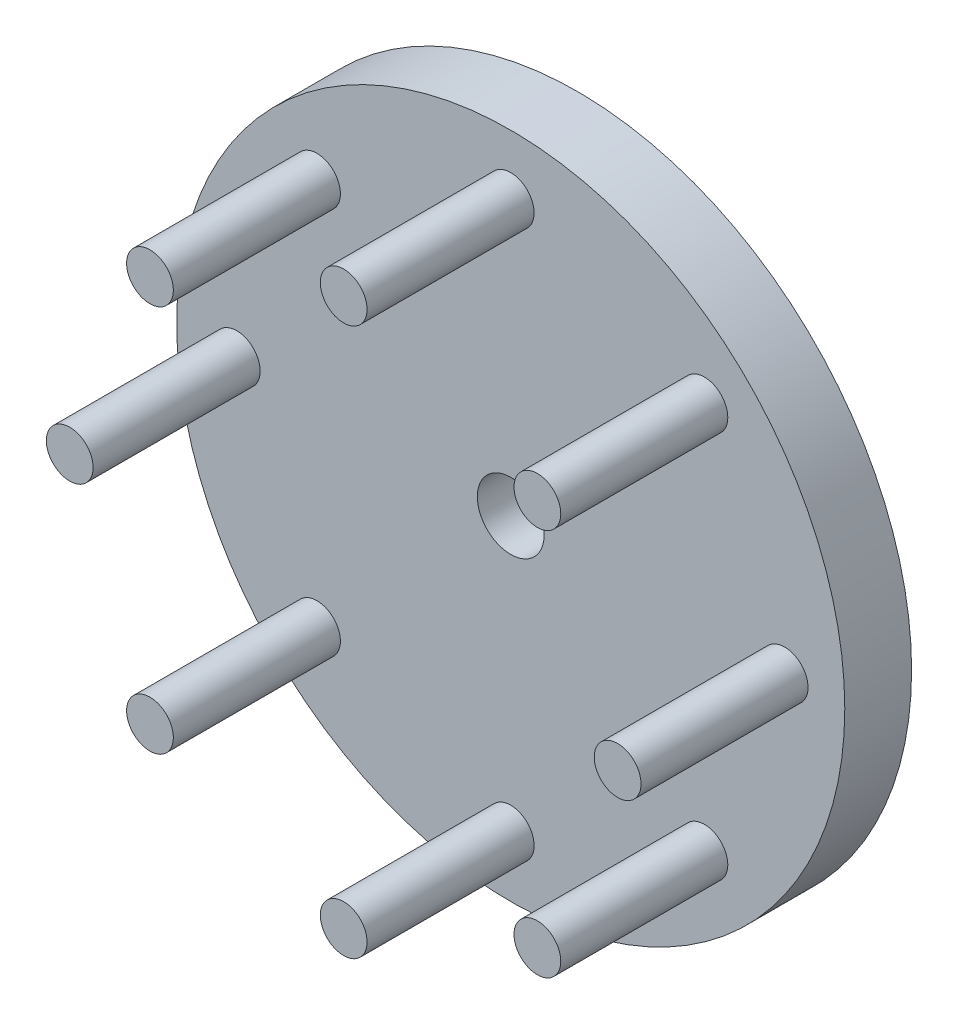
ISO-10303-21;
HEADER;
FILE_DESCRIPTION(('STEP AP214'),'2;1');
FILE_NAME('part.step','',(''),(''),'','','');
FILE_SCHEMA(('AUTOMOTIVE_DESIGN { 1 0 10303 214 1 1 1 1 }'));
ENDSEC;
DATA;
#1=APPLICATION_CONTEXT('core data for automotive mechanical design processes');
#2=APPLICATION_PROTOCOL_DEFINITION('international standard','automotive_design',2000,#1);
#3=PRODUCT_CONTEXT('',#1,'mechanical');
#4=PRODUCT('Part','Part','',(#3));
#5=PRODUCT_RELATED_PRODUCT_CATEGORY('part','',(#4));
#6=PRODUCT_DEFINITION_FORMATION('','',#4);
#7=PRODUCT_DEFINITION_CONTEXT('part definition',#1,'design');
#8=PRODUCT_DEFINITION('design','',#6,#7);
#9=PRODUCT_DEFINITION_SHAPE('','',#8);
#10=(LENGTH_UNIT() NAMED_UNIT(*) SI_UNIT(.MILLI.,.METRE.));
#11=(NAMED_UNIT(*) PLANE_ANGLE_UNIT() SI_UNIT($,.RADIAN.));
#12=(NAMED_UNIT(*) SI_UNIT($,.STERADIAN.) SOLID_ANGLE_UNIT());
#13=UNCERTAINTY_MEASURE_WITH_UNIT(LENGTH_MEASURE(1.E-05),#10,'distance_accuracy_value','');
#14=(GEOMETRIC_REPRESENTATION_CONTEXT(3) GLOBAL_UNCERTAINTY_ASSIGNED_CONTEXT((#13)) GLOBAL_UNIT_ASSIGNED_CONTEXT((#10,
#11,#12)) REPRESENTATION_CONTEXT('',''));
#15=CARTESIAN_POINT('',(0.,0.,0.));
#16=DIRECTION('',(0.,0.,1.));
#17=DIRECTION('',(1.,0.,0.));
#18=AXIS2_PLACEMENT_3D('',#15,#16,#17);
#19=CARTESIAN_POINT('',(0.,0.,10.));
#20=DIRECTION('',(0.,0.,1.));
#21=DIRECTION('',(1.,0.,0.));
#22=AXIS2_PLACEMENT_3D('',#19,#20,#21);
#23=PLANE('',#22);
#24=CARTESIAN_POINT('',(-28.9913780286479,28.9913780286472,10.));
#25=DIRECTION('',(0.,0.,1.));
#26=DIRECTION('',(1.,0.,0.));
#27=AXIS2_PLACEMENT_3D('',#24,#25,#26);
#28=CIRCLE('',#27,3.50000000000134);
#29=CARTESIAN_POINT('',(-25.4913780286466,28.9913780286472,10.));
#30=VERTEX_POINT('',#29);
#31=EDGE_CURVE('E92',#30,#30,#28,.T.);
#32=ORIENTED_EDGE('',*,*,#31,.F.);
#33=EDGE_LOOP('',(#32));
#34=FACE_BOUND('',#33,.T.);
#35=CARTESIAN_POINT('',(-40.9999999999983,-1.74793512996985E-12,10.));
#36=DIRECTION('',(0.,0.,1.));
#37=DIRECTION('',(1.,0.,0.));
#38=AXIS2_PLACEMENT_3D('',#35,#36,#37);
#39=CIRCLE('',#38,3.50000000000259);
#40=CARTESIAN_POINT('',(-37.4999999999957,-1.74793512996985E-12,10.));
#41=VERTEX_POINT('',#40);
#42=EDGE_CURVE('E86',#41,#41,#39,.T.);
#43=ORIENTED_EDGE('',*,*,#42,.F.);
#44=EDGE_LOOP('',(#43));
#45=FACE_BOUND('',#44,.T.);
#46=CARTESIAN_POINT('',(-28.9913780286455,-28.9913780286497,10.));
#47=DIRECTION('',(0.,0.,1.));
#48=DIRECTION('',(1.,0.,0.));
#49=AXIS2_PLACEMENT_3D('',#46,#47,#48);
#50=CIRCLE('',#49,3.50000000000355);
#51=CARTESIAN_POINT('',(-25.4913780286419,-28.9913780286497,10.));
#52=VERTEX_POINT('',#51);
#53=EDGE_CURVE('E80',#52,#52,#50,.T.);
#54=ORIENTED_EDGE('',*,*,#53,.F.);
#55=EDGE_LOOP('',(#54));
#56=FACE_BOUND('',#55,.T.);
#57=CARTESIAN_POINT('',(3.48582815618668E-12,-41.,10.));
#58=DIRECTION('',(0.,0.,1.));
#59=DIRECTION('',(1.,0.,0.));
#60=AXIS2_PLACEMENT_3D('',#57,#58,#59);
#61=CIRCLE('',#60,3.50000000000361);
#62=CARTESIAN_POINT('',(3.5000000000071,-41.,10.));
#63=VERTEX_POINT('',#62);
#64=EDGE_CURVE('E74',#63,#63,#61,.T.);
#65=ORIENTED_EDGE('',*,*,#64,.F.);
#66=EDGE_LOOP('',(#65));
#67=FACE_BOUND('',#66,.T.);
#68=CARTESIAN_POINT('',(28.9913780286514,-28.9913780286472,10.));
#69=DIRECTION('',(0.,0.,1.));
#70=DIRECTION('',(1.,0.,0.));
#71=AXIS2_PLACEMENT_3D('',#68,#69,#70);
#72=CIRCLE('',#71,3.50000000000269);
#73=CARTESIAN_POINT('',(32.4913780286541,-28.9913780286472,10.));
#74=VERTEX_POINT('',#73);
#75=EDGE_CURVE('E68',#74,#74,#72,.T.);
#76=ORIENTED_EDGE('',*,*,#75,.F.);
#77=EDGE_LOOP('',(#76));
#78=FACE_BOUND('',#77,.T.);
#79=CARTESIAN_POINT('',(41.0000000000017,1.74291407809334E-12,10.));
#80=DIRECTION('',(0.,0.,1.));
#81=DIRECTION('',(1.,0.,0.));
#82=AXIS2_PLACEMENT_3D('',#79,#80,#81);
#83=CIRCLE('',#82,3.50000000000129);
#84=CARTESIAN_POINT('',(44.500000000003,1.74291407809334E-12,10.));
#85=VERTEX_POINT('',#84);
#86=EDGE_CURVE('E62',#85,#85,#83,.T.);
#87=ORIENTED_EDGE('',*,*,#86,.F.);
#88=EDGE_LOOP('',(#87));
#89=FACE_BOUND('',#88,.T.);
#90=CARTESIAN_POINT('',(28.991378028649,28.9913780286497,10.));
#91=DIRECTION('',(0.,0.,1.));
#92=DIRECTION('',(1.,0.,0.));
#93=AXIS2_PLACEMENT_3D('',#90,#91,#92);
#94=CIRCLE('',#93,3.5000000000002);
#95=CARTESIAN_POINT('',(32.4913780286492,28.9913780286497,10.));
#96=VERTEX_POINT('',#95);
#97=EDGE_CURVE('E56',#96,#96,#94,.T.);
#98=ORIENTED_EDGE('',*,*,#97,.F.);
#99=EDGE_LOOP('',(#98));
#100=FACE_BOUND('',#99,.T.);
#101=CARTESIAN_POINT('',(0.,41.,10.));
#102=DIRECTION('',(0.,0.,1.));
#103=DIRECTION('',(1.,0.,0.));
#104=AXIS2_PLACEMENT_3D('',#101,#102,#103);
#105=CIRCLE('',#104,3.5);
#106=CARTESIAN_POINT('',(3.5,41.,10.));
#107=VERTEX_POINT('',#106);
#108=EDGE_CURVE('E53',#107,#107,#105,.T.);
#109=ORIENTED_EDGE('',*,*,#108,.F.);
#110=EDGE_LOOP('',(#109));
#111=FACE_BOUND('',#110,.T.);
#112=CARTESIAN_POINT('',(0.,0.,10.));
#113=DIRECTION('',(0.,0.,1.));
#114=DIRECTION('',(1.,0.,0.));
#115=AXIS2_PLACEMENT_3D('',#112,#113,#114);
#116=CIRCLE('',#115,50.);
#117=CARTESIAN_POINT('',(50.,0.,10.));
#118=VERTEX_POINT('',#117);
#119=EDGE_CURVE('E10',#118,#118,#116,.T.);
#120=ORIENTED_EDGE('',*,*,#119,.T.);
#121=EDGE_LOOP('',(#120));
#122=FACE_BOUND('',#121,.T.);
#123=CARTESIAN_POINT('',(0.,0.,10.));
#124=DIRECTION('',(0.,0.,1.));
#125=DIRECTION('',(1.,0.,0.));
#126=AXIS2_PLACEMENT_3D('',#123,#124,#125);
#127=CIRCLE('',#126,5.);
#128=CARTESIAN_POINT('',(5.,0.,10.));
#129=VERTEX_POINT('',#128);
#130=EDGE_CURVE('E45',#129,#129,#127,.T.);
#131=ORIENTED_EDGE('',*,*,#130,.F.);
#132=EDGE_LOOP('',(#131));
#133=FACE_BOUND('',#132,.T.);
#134=ADVANCED_FACE('F34',(#34,#45,#56,#67,#78,#89,#100,#111,#122,#133),#23,.T.);
#135=CARTESIAN_POINT('',(0.,0.,0.));
#136=DIRECTION('',(0.,0.,1.));
#137=DIRECTION('',(1.,0.,0.));
#138=AXIS2_PLACEMENT_3D('',#135,#136,#137);
#139=PLANE('',#138);
#140=CARTESIAN_POINT('',(0.,0.,0.));
#141=DIRECTION('',(0.,0.,1.));
#142=DIRECTION('',(1.,0.,0.));
#143=AXIS2_PLACEMENT_3D('',#140,#141,#142);
#144=CIRCLE('',#143,50.);
#145=CARTESIAN_POINT('',(50.,0.,0.));
#146=VERTEX_POINT('',#145);
#147=EDGE_CURVE('E38',#146,#146,#144,.T.);
#148=ORIENTED_EDGE('',*,*,#147,.F.);
#149=EDGE_LOOP('',(#148));
#150=FACE_BOUND('',#149,.T.);
#151=CARTESIAN_POINT('',(0.,0.,0.));
#152=DIRECTION('',(0.,0.,1.));
#153=DIRECTION('',(1.,0.,0.));
#154=AXIS2_PLACEMENT_3D('',#151,#152,#153);
#155=CIRCLE('',#154,5.);
#156=CARTESIAN_POINT('',(5.,0.,0.));
#157=VERTEX_POINT('',#156);
#158=EDGE_CURVE('E47',#157,#157,#155,.T.);
#159=ORIENTED_EDGE('',*,*,#158,.T.);
#160=EDGE_LOOP('',(#159));
#161=FACE_BOUND('',#160,.T.);
#162=ADVANCED_FACE('F105',(#150,#161),#139,.F.);
#163=CARTESIAN_POINT('',(0.,0.,10.));
#164=DIRECTION('',(0.,0.,-1.));
#165=DIRECTION('',(-1.,0.,0.));
#166=AXIS2_PLACEMENT_3D('',#163,#164,#165);
#167=CYLINDRICAL_SURFACE('',#166,50.);
#168=ORIENTED_EDGE('',*,*,#119,.F.);
#169=EDGE_LOOP('',(#168));
#170=FACE_BOUND('',#169,.T.);
#171=ORIENTED_EDGE('',*,*,#147,.T.);
#172=EDGE_LOOP('',(#171));
#173=FACE_BOUND('',#172,.T.);
#174=ADVANCED_FACE('F36',(#170,#173),#167,.T.);
#175=CARTESIAN_POINT('',(0.,0.,10.));
#176=DIRECTION('',(0.,0.,-1.));
#177=DIRECTION('',(-1.,0.,0.));
#178=AXIS2_PLACEMENT_3D('',#175,#176,#177);
#179=CYLINDRICAL_SURFACE('',#178,5.);
#180=ORIENTED_EDGE('',*,*,#130,.T.);
#181=EDGE_LOOP('',(#180));
#182=FACE_BOUND('',#181,.T.);
#183=ORIENTED_EDGE('',*,*,#158,.F.);
#184=EDGE_LOOP('',(#183));
#185=FACE_BOUND('',#184,.T.);
#186=ADVANCED_FACE('F123',(#182,#185),#179,.F.);
#187=CARTESIAN_POINT('',(0.,41.,35.));
#188=DIRECTION('',(0.,0.,-1.));
#189=DIRECTION('',(-1.,0.,0.));
#190=AXIS2_PLACEMENT_3D('',#187,#188,#189);
#191=CYLINDRICAL_SURFACE('',#190,3.5);
#192=CARTESIAN_POINT('',(0.,41.,35.));
#193=DIRECTION('',(0.,0.,1.));
#194=DIRECTION('',(1.,0.,0.));
#195=AXIS2_PLACEMENT_3D('',#192,#193,#194);
#196=CIRCLE('',#195,3.5);
#197=CARTESIAN_POINT('',(3.5,41.,35.));
#198=VERTEX_POINT('',#197);
#199=EDGE_CURVE('E50',#198,#198,#196,.T.);
#200=ORIENTED_EDGE('',*,*,#199,.F.);
#201=EDGE_LOOP('',(#200));
#202=FACE_BOUND('',#201,.T.);
#203=ORIENTED_EDGE('',*,*,#108,.T.);
#204=EDGE_LOOP('',(#203));
#205=FACE_BOUND('',#204,.T.);
#206=ADVANCED_FACE('F126',(#202,#205),#191,.T.);
#207=CARTESIAN_POINT('',(0.,41.,35.));
#208=DIRECTION('',(0.,0.,1.));
#209=DIRECTION('',(1.,0.,0.));
#210=AXIS2_PLACEMENT_3D('',#207,#208,#209);
#211=PLANE('',#210);
#212=ORIENTED_EDGE('',*,*,#199,.T.);
#213=EDGE_LOOP('',(#212));
#214=FACE_BOUND('',#213,.T.);
#215=ADVANCED_FACE('F140',(#214),#211,.T.);
#216=CARTESIAN_POINT('',(28.991378028649,28.9913780286497,35.));
#217=DIRECTION('',(0.,0.,-1.));
#218=DIRECTION('',(-1.,0.,0.));
#219=AXIS2_PLACEMENT_3D('',#216,#217,#218);
#220=CYLINDRICAL_SURFACE('',#219,3.5000000000002);
#221=CARTESIAN_POINT('',(28.991378028649,28.9913780286497,35.));
#222=DIRECTION('',(0.,0.,1.));
#223=DIRECTION('',(1.,0.,0.));
#224=AXIS2_PLACEMENT_3D('',#221,#222,#223);
#225=CIRCLE('',#224,3.5000000000002);
#226=CARTESIAN_POINT('',(32.4913780286492,28.9913780286497,35.));
#227=VERTEX_POINT('',#226);
#228=EDGE_CURVE('E59',#227,#227,#225,.T.);
#229=ORIENTED_EDGE('',*,*,#228,.F.);
#230=EDGE_LOOP('',(#229));
#231=FACE_BOUND('',#230,.T.);
#232=ORIENTED_EDGE('',*,*,#97,.T.);
#233=EDGE_LOOP('',(#232));
#234=FACE_BOUND('',#233,.T.);
#235=ADVANCED_FACE('F144',(#231,#234),#220,.T.);
#236=CARTESIAN_POINT('',(28.991378028649,28.9913780286497,35.));
#237=DIRECTION('',(0.,0.,1.));
#238=DIRECTION('',(1.,0.,0.));
#239=AXIS2_PLACEMENT_3D('',#236,#237,#238);
#240=PLANE('',#239);
#241=ORIENTED_EDGE('',*,*,#228,.T.);
#242=EDGE_LOOP('',(#241));
#243=FACE_BOUND('',#242,.T.);
#244=ADVANCED_FACE('F146',(#243),#240,.T.);
#245=CARTESIAN_POINT('',(41.0000000000017,1.74291407809334E-12,35.));
#246=DIRECTION('',(0.,0.,-1.));
#247=DIRECTION('',(-1.,0.,0.));
#248=AXIS2_PLACEMENT_3D('',#245,#246,#247);
#249=CYLINDRICAL_SURFACE('',#248,3.50000000000129);
#250=CARTESIAN_POINT('',(41.0000000000017,1.74291407809334E-12,35.));
#251=DIRECTION('',(0.,0.,1.));
#252=DIRECTION('',(1.,0.,0.));
#253=AXIS2_PLACEMENT_3D('',#250,#251,#252);
#254=CIRCLE('',#253,3.50000000000129);
#255=CARTESIAN_POINT('',(44.500000000003,1.74291407809334E-12,35.));
#256=VERTEX_POINT('',#255);
#257=EDGE_CURVE('E65',#256,#256,#254,.T.);
#258=ORIENTED_EDGE('',*,*,#257,.F.);
#259=EDGE_LOOP('',(#258));
#260=FACE_BOUND('',#259,.T.);
#261=ORIENTED_EDGE('',*,*,#86,.T.);
#262=EDGE_LOOP('',(#261));
#263=FACE_BOUND('',#262,.T.);
#264=ADVANCED_FACE('F149',(#260,#263),#249,.T.);
#265=CARTESIAN_POINT('',(41.0000000000017,1.74291407809334E-12,35.));
#266=DIRECTION('',(0.,0.,1.));
#267=DIRECTION('',(1.,0.,0.));
#268=AXIS2_PLACEMENT_3D('',#265,#266,#267);
#269=PLANE('',#268);
#270=ORIENTED_EDGE('',*,*,#257,.T.);
#271=EDGE_LOOP('',(#270));
#272=FACE_BOUND('',#271,.T.);
#273=ADVANCED_FACE('F154',(#272),#269,.T.);
#274=CARTESIAN_POINT('',(28.9913780286514,-28.9913780286472,35.));
#275=DIRECTION('',(0.,0.,-1.));
#276=DIRECTION('',(-1.,0.,0.));
#277=AXIS2_PLACEMENT_3D('',#274,#275,#276);
#278=CYLINDRICAL_SURFACE('',#277,3.50000000000269);
#279=CARTESIAN_POINT('',(28.9913780286514,-28.9913780286472,35.));
#280=DIRECTION('',(0.,0.,1.));
#281=DIRECTION('',(1.,0.,0.));
#282=AXIS2_PLACEMENT_3D('',#279,#280,#281);
#283=CIRCLE('',#282,3.50000000000269);
#284=CARTESIAN_POINT('',(32.4913780286541,-28.9913780286472,35.));
#285=VERTEX_POINT('',#284);
#286=EDGE_CURVE('E71',#285,#285,#283,.T.);
#287=ORIENTED_EDGE('',*,*,#286,.F.);
#288=EDGE_LOOP('',(#287));
#289=FACE_BOUND('',#288,.T.);
#290=ORIENTED_EDGE('',*,*,#75,.T.);
#291=EDGE_LOOP('',(#290));
#292=FACE_BOUND('',#291,.T.);
#293=ADVANCED_FACE('F157',(#289,#292),#278,.T.);
#294=CARTESIAN_POINT('',(28.9913780286514,-28.9913780286472,35.));
#295=DIRECTION('',(0.,0.,1.));
#296=DIRECTION('',(1.,0.,0.));
#297=AXIS2_PLACEMENT_3D('',#294,#295,#296);
#298=PLANE('',#297);
#299=ORIENTED_EDGE('',*,*,#286,.T.);
#300=EDGE_LOOP('',(#299));
#301=FACE_BOUND('',#300,.T.);
#302=ADVANCED_FACE('F162',(#301),#298,.T.);
#303=CARTESIAN_POINT('',(3.48582815618668E-12,-41.,35.));
#304=DIRECTION('',(0.,0.,-1.));
#305=DIRECTION('',(-1.,0.,0.));
#306=AXIS2_PLACEMENT_3D('',#303,#304,#305);
#307=CYLINDRICAL_SURFACE('',#306,3.50000000000361);
#308=CARTESIAN_POINT('',(3.48582815618668E-12,-41.,35.));
#309=DIRECTION('',(0.,0.,1.));
#310=DIRECTION('',(1.,0.,0.));
#311=AXIS2_PLACEMENT_3D('',#308,#309,#310);
#312=CIRCLE('',#311,3.50000000000361);
#313=CARTESIAN_POINT('',(3.5000000000071,-41.,35.));
#314=VERTEX_POINT('',#313);
#315=EDGE_CURVE('E77',#314,#314,#312,.T.);
#316=ORIENTED_EDGE('',*,*,#315,.F.);
#317=EDGE_LOOP('',(#316));
#318=FACE_BOUND('',#317,.T.);
#319=ORIENTED_EDGE('',*,*,#64,.T.);
#320=EDGE_LOOP('',(#319));
#321=FACE_BOUND('',#320,.T.);
#322=ADVANCED_FACE('F165',(#318,#321),#307,.T.);
#323=CARTESIAN_POINT('',(3.48582815618668E-12,-41.,35.));
#324=DIRECTION('',(0.,0.,1.));
#325=DIRECTION('',(1.,0.,0.));
#326=AXIS2_PLACEMENT_3D('',#323,#324,#325);
#327=PLANE('',#326);
#328=ORIENTED_EDGE('',*,*,#315,.T.);
#329=EDGE_LOOP('',(#328));
#330=FACE_BOUND('',#329,.T.);
#331=ADVANCED_FACE('F170',(#330),#327,.T.);
#332=CARTESIAN_POINT('',(-28.9913780286455,-28.9913780286497,35.));
#333=DIRECTION('',(0.,0.,-1.));
#334=DIRECTION('',(-1.,0.,0.));
#335=AXIS2_PLACEMENT_3D('',#332,#333,#334);
#336=CYLINDRICAL_SURFACE('',#335,3.50000000000355);
#337=CARTESIAN_POINT('',(-28.9913780286455,-28.9913780286497,35.));
#338=DIRECTION('',(0.,0.,1.));
#339=DIRECTION('',(1.,0.,0.));
#340=AXIS2_PLACEMENT_3D('',#337,#338,#339);
#341=CIRCLE('',#340,3.50000000000355);
#342=CARTESIAN_POINT('',(-25.4913780286419,-28.9913780286497,35.));
#343=VERTEX_POINT('',#342);
#344=EDGE_CURVE('E83',#343,#343,#341,.T.);
#345=ORIENTED_EDGE('',*,*,#344,.F.);
#346=EDGE_LOOP('',(#345));
#347=FACE_BOUND('',#346,.T.);
#348=ORIENTED_EDGE('',*,*,#53,.T.);
#349=EDGE_LOOP('',(#348));
#350=FACE_BOUND('',#349,.T.);
#351=ADVANCED_FACE('F173',(#347,#350),#336,.T.);
#352=CARTESIAN_POINT('',(-28.9913780286455,-28.9913780286497,35.));
#353=DIRECTION('',(0.,0.,1.));
#354=DIRECTION('',(1.,0.,0.));
#355=AXIS2_PLACEMENT_3D('',#352,#353,#354);
#356=PLANE('',#355);
#357=ORIENTED_EDGE('',*,*,#344,.T.);
#358=EDGE_LOOP('',(#357));
#359=FACE_BOUND('',#358,.T.);
#360=ADVANCED_FACE('F178',(#359),#356,.T.);
#361=CARTESIAN_POINT('',(-40.9999999999983,-1.74793512996985E-12,35.));
#362=DIRECTION('',(0.,0.,-1.));
#363=DIRECTION('',(-1.,0.,0.));
#364=AXIS2_PLACEMENT_3D('',#361,#362,#363);
#365=CYLINDRICAL_SURFACE('',#364,3.50000000000259);
#366=CARTESIAN_POINT('',(-40.9999999999983,-1.74793512996985E-12,35.));
#367=DIRECTION('',(0.,0.,1.));
#368=DIRECTION('',(1.,0.,0.));
#369=AXIS2_PLACEMENT_3D('',#366,#367,#368);
#370=CIRCLE('',#369,3.50000000000259);
#371=CARTESIAN_POINT('',(-37.4999999999957,-1.74793512996985E-12,35.));
#372=VERTEX_POINT('',#371);
#373=EDGE_CURVE('E89',#372,#372,#370,.T.);
#374=ORIENTED_EDGE('',*,*,#373,.F.);
#375=EDGE_LOOP('',(#374));
#376=FACE_BOUND('',#375,.T.);
#377=ORIENTED_EDGE('',*,*,#42,.T.);
#378=EDGE_LOOP('',(#377));
#379=FACE_BOUND('',#378,.T.);
#380=ADVANCED_FACE('F181',(#376,#379),#365,.T.);
#381=CARTESIAN_POINT('',(-40.9999999999983,-1.74793512996985E-12,35.));
#382=DIRECTION('',(0.,0.,1.));
#383=DIRECTION('',(1.,0.,0.));
#384=AXIS2_PLACEMENT_3D('',#381,#382,#383);
#385=PLANE('',#384);
#386=ORIENTED_EDGE('',*,*,#373,.T.);
#387=EDGE_LOOP('',(#386));
#388=FACE_BOUND('',#387,.T.);
#389=ADVANCED_FACE('F186',(#388),#385,.T.);
#390=CARTESIAN_POINT('',(-28.9913780286479,28.9913780286472,35.));
#391=DIRECTION('',(0.,0.,-1.));
#392=DIRECTION('',(-1.,0.,0.));
#393=AXIS2_PLACEMENT_3D('',#390,#391,#392);
#394=CYLINDRICAL_SURFACE('',#393,3.50000000000134);
#395=CARTESIAN_POINT('',(-28.9913780286479,28.9913780286472,35.));
#396=DIRECTION('',(0.,0.,1.));
#397=DIRECTION('',(1.,0.,0.));
#398=AXIS2_PLACEMENT_3D('',#395,#396,#397);
#399=CIRCLE('',#398,3.50000000000134);
#400=CARTESIAN_POINT('',(-25.4913780286466,28.9913780286472,35.));
#401=VERTEX_POINT('',#400);
#402=EDGE_CURVE('E95',#401,#401,#399,.T.);
#403=ORIENTED_EDGE('',*,*,#402,.F.);
#404=EDGE_LOOP('',(#403));
#405=FACE_BOUND('',#404,.T.);
#406=ORIENTED_EDGE('',*,*,#31,.T.);
#407=EDGE_LOOP('',(#406));
#408=FACE_BOUND('',#407,.T.);
#409=ADVANCED_FACE('F101',(#405,#408),#394,.T.);
#410=CARTESIAN_POINT('',(-28.9913780286479,28.9913780286472,35.));
#411=DIRECTION('',(0.,0.,1.));
#412=DIRECTION('',(1.,0.,0.));
#413=AXIS2_PLACEMENT_3D('',#410,#411,#412);
#414=PLANE('',#413);
#415=ORIENTED_EDGE('',*,*,#402,.T.);
#416=EDGE_LOOP('',(#415));
#417=FACE_BOUND('',#416,.T.);
#418=ADVANCED_FACE('F193',(#417),#414,.T.);
#419=CLOSED_SHELL('',(#134,#162,#174,#186,#206,#215,#235,#244,#264,#273,#293,#302,#322,#331,
#351,#360,#380,#389,#409,#418));
#420=MANIFOLD_SOLID_BREP('B2',#419);
#421=ADVANCED_BREP_SHAPE_REPRESENTATION('',(#18,#420),#14);
#422=SHAPE_DEFINITION_REPRESENTATION(#9,#421);
ENDSEC;
END-ISO-10303-21;
